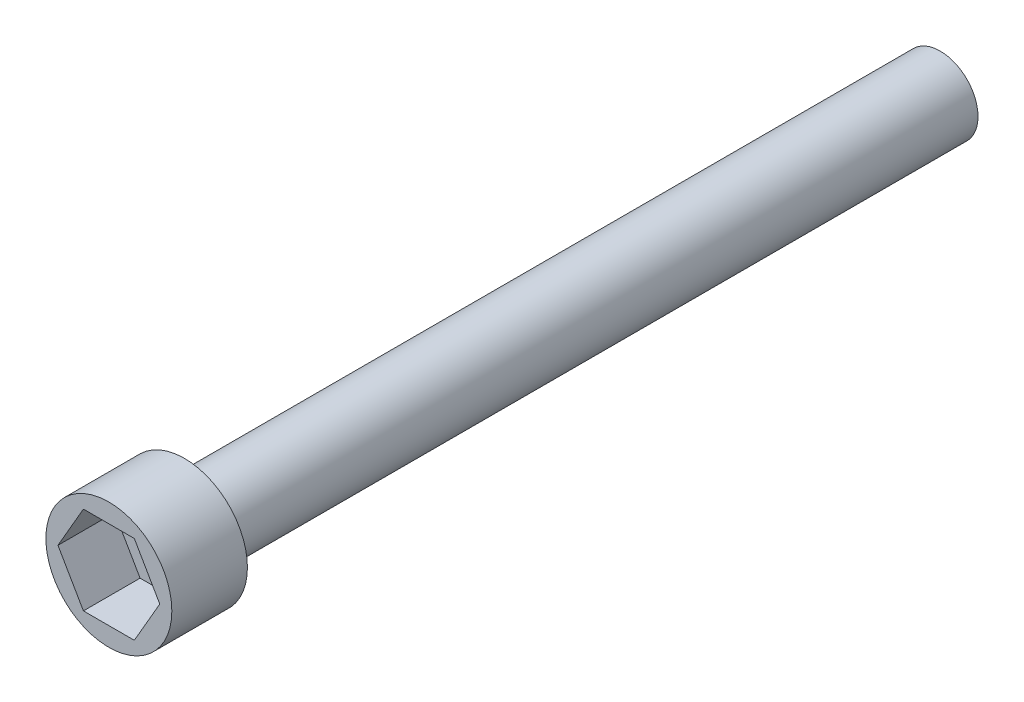
ISO-10303-21;
HEADER;
FILE_DESCRIPTION(('STEP AP214'),'2;1');
FILE_NAME('part.step','',(''),(''),'','','');
FILE_SCHEMA(('AUTOMOTIVE_DESIGN { 1 0 10303 214 1 1 1 1 }'));
ENDSEC;
DATA;
#1=APPLICATION_CONTEXT('core data for automotive mechanical design processes');
#2=APPLICATION_PROTOCOL_DEFINITION('international standard','automotive_design',2000,#1);
#3=PRODUCT_CONTEXT('',#1,'mechanical');
#4=PRODUCT('Part','Part','',(#3));
#5=PRODUCT_RELATED_PRODUCT_CATEGORY('part','',(#4));
#6=PRODUCT_DEFINITION_FORMATION('','',#4);
#7=PRODUCT_DEFINITION_CONTEXT('part definition',#1,'design');
#8=PRODUCT_DEFINITION('design','',#6,#7);
#9=PRODUCT_DEFINITION_SHAPE('','',#8);
#10=(LENGTH_UNIT() NAMED_UNIT(*) SI_UNIT(.MILLI.,.METRE.));
#11=(NAMED_UNIT(*) PLANE_ANGLE_UNIT() SI_UNIT($,.RADIAN.));
#12=(NAMED_UNIT(*) SI_UNIT($,.STERADIAN.) SOLID_ANGLE_UNIT());
#13=UNCERTAINTY_MEASURE_WITH_UNIT(LENGTH_MEASURE(1.E-05),#10,'distance_accuracy_value','');
#14=(GEOMETRIC_REPRESENTATION_CONTEXT(3) GLOBAL_UNCERTAINTY_ASSIGNED_CONTEXT((#13)) GLOBAL_UNIT_ASSIGNED_CONTEXT((#10,
#11,#12)) REPRESENTATION_CONTEXT('',''));
#15=CARTESIAN_POINT('',(0.,0.,0.));
#16=DIRECTION('',(0.,0.,1.));
#17=DIRECTION('',(1.,0.,0.));
#18=AXIS2_PLACEMENT_3D('',#15,#16,#17);
#19=CARTESIAN_POINT('',(0.,0.,60.));
#20=DIRECTION('',(0.,0.,-1.));
#21=DIRECTION('',(-1.,0.,0.));
#22=AXIS2_PLACEMENT_3D('',#19,#20,#21);
#23=CYLINDRICAL_SURFACE('',#22,3.);
#24=CARTESIAN_POINT('',(0.,0.,60.));
#25=DIRECTION('',(0.,0.,1.));
#26=DIRECTION('',(1.,0.,0.));
#27=AXIS2_PLACEMENT_3D('',#24,#25,#26);
#28=CIRCLE('',#27,3.);
#29=CARTESIAN_POINT('',(3.,0.,60.));
#30=VERTEX_POINT('',#29);
#31=EDGE_CURVE('E11',#30,#30,#28,.T.);
#32=ORIENTED_EDGE('',*,*,#31,.F.);
#33=EDGE_LOOP('',(#32));
#34=FACE_BOUND('',#33,.T.);
#35=CARTESIAN_POINT('',(0.,0.,0.));
#36=DIRECTION('',(0.,0.,1.));
#37=DIRECTION('',(1.,0.,0.));
#38=AXIS2_PLACEMENT_3D('',#35,#36,#37);
#39=CIRCLE('',#38,3.);
#40=CARTESIAN_POINT('',(3.,0.,0.));
#41=VERTEX_POINT('',#40);
#42=EDGE_CURVE('E44',#41,#41,#39,.T.);
#43=ORIENTED_EDGE('',*,*,#42,.T.);
#44=EDGE_LOOP('',(#43));
#45=FACE_BOUND('',#44,.T.);
#46=ADVANCED_FACE('F41',(#34,#45),#23,.T.);
#47=CARTESIAN_POINT('',(0.,0.,0.));
#48=DIRECTION('',(0.,0.,1.));
#49=DIRECTION('',(1.,0.,0.));
#50=AXIS2_PLACEMENT_3D('',#47,#48,#49);
#51=PLANE('',#50);
#52=ORIENTED_EDGE('',*,*,#42,.F.);
#53=EDGE_LOOP('',(#52));
#54=FACE_BOUND('',#53,.T.);
#55=ADVANCED_FACE('F191',(#54),#51,.F.);
#56=CARTESIAN_POINT('',(0.,0.,66.));
#57=DIRECTION('',(0.,0.,-1.));
#58=DIRECTION('',(-1.,0.,0.));
#59=AXIS2_PLACEMENT_3D('',#56,#57,#58);
#60=CYLINDRICAL_SURFACE('',#59,5.);
#61=CARTESIAN_POINT('',(0.,0.,66.));
#62=DIRECTION('',(0.,0.,1.));
#63=DIRECTION('',(1.,0.,0.));
#64=AXIS2_PLACEMENT_3D('',#61,#62,#63);
#65=CIRCLE('',#64,5.);
#66=CARTESIAN_POINT('',(5.,0.,66.));
#67=VERTEX_POINT('',#66);
#68=EDGE_CURVE('E165',#67,#67,#65,.T.);
#69=ORIENTED_EDGE('',*,*,#68,.F.);
#70=EDGE_LOOP('',(#69));
#71=FACE_BOUND('',#70,.T.);
#72=CARTESIAN_POINT('',(0.,0.,60.));
#73=DIRECTION('',(0.,0.,1.));
#74=DIRECTION('',(1.,0.,0.));
#75=AXIS2_PLACEMENT_3D('',#72,#73,#74);
#76=CIRCLE('',#75,5.);
#77=CARTESIAN_POINT('',(5.,0.,60.));
#78=VERTEX_POINT('',#77);
#79=EDGE_CURVE('E155',#78,#78,#76,.T.);
#80=ORIENTED_EDGE('',*,*,#79,.T.);
#81=EDGE_LOOP('',(#80));
#82=FACE_BOUND('',#81,.T.);
#83=ADVANCED_FACE('F173',(#71,#82),#60,.T.);
#84=CARTESIAN_POINT('',(0.,0.,66.));
#85=DIRECTION('',(0.,0.,1.));
#86=DIRECTION('',(1.,0.,0.));
#87=AXIS2_PLACEMENT_3D('',#84,#85,#86);
#88=PLANE('',#87);
#89=DIRECTION('',(0.5,0.866025403784439,0.));
#90=VECTOR('',#89,1.);
#91=CARTESIAN_POINT('',(2.02072594216369,-3.5,66.));
#92=LINE('',#91,#90);
#93=CARTESIAN_POINT('',(2.02072594216369,-3.5,66.));
#94=VERTEX_POINT('',#93);
#95=CARTESIAN_POINT('',(4.04145188432738,0.,66.));
#96=VERTEX_POINT('',#95);
#97=EDGE_CURVE('E56',#94,#96,#92,.T.);
#98=ORIENTED_EDGE('',*,*,#97,.F.);
#99=DIRECTION('',(1.,0.,0.));
#100=VECTOR('',#99,1.);
#101=CARTESIAN_POINT('',(-2.02072594216369,-3.5,66.));
#102=LINE('',#101,#100);
#103=CARTESIAN_POINT('',(-2.02072594216369,-3.5,66.));
#104=VERTEX_POINT('',#103);
#105=EDGE_CURVE('E149',#104,#94,#102,.T.);
#106=ORIENTED_EDGE('',*,*,#105,.F.);
#107=DIRECTION('',(0.5,-0.866025403784439,0.));
#108=VECTOR('',#107,1.);
#109=CARTESIAN_POINT('',(-4.04145188432738,0.,66.));
#110=LINE('',#109,#108);
#111=CARTESIAN_POINT('',(-4.04145188432738,0.,66.));
#112=VERTEX_POINT('',#111);
#113=EDGE_CURVE('E146',#112,#104,#110,.T.);
#114=ORIENTED_EDGE('',*,*,#113,.F.);
#115=DIRECTION('',(-0.5,-0.866025403784439,0.));
#116=VECTOR('',#115,1.);
#117=CARTESIAN_POINT('',(-2.02072594216369,3.5,66.));
#118=LINE('',#117,#116);
#119=CARTESIAN_POINT('',(-2.02072594216369,3.5,66.));
#120=VERTEX_POINT('',#119);
#121=EDGE_CURVE('E104',#120,#112,#118,.T.);
#122=ORIENTED_EDGE('',*,*,#121,.F.);
#123=DIRECTION('',(-1.,0.,0.));
#124=VECTOR('',#123,1.);
#125=CARTESIAN_POINT('',(2.02072594216369,3.5,66.));
#126=LINE('',#125,#124);
#127=CARTESIAN_POINT('',(2.02072594216369,3.5,66.));
#128=VERTEX_POINT('',#127);
#129=EDGE_CURVE('E140',#128,#120,#126,.T.);
#130=ORIENTED_EDGE('',*,*,#129,.F.);
#131=DIRECTION('',(-0.5,0.866025403784439,0.));
#132=VECTOR('',#131,1.);
#133=CARTESIAN_POINT('',(4.04145188432738,0.,66.));
#134=LINE('',#133,#132);
#135=EDGE_CURVE('E136',#96,#128,#134,.T.);
#136=ORIENTED_EDGE('',*,*,#135,.F.);
#137=EDGE_LOOP('',(#98,#106,#114,#122,#130,#136));
#138=FACE_BOUND('',#137,.T.);
#139=ORIENTED_EDGE('',*,*,#68,.T.);
#140=EDGE_LOOP('',(#139));
#141=FACE_BOUND('',#140,.T.);
#142=ADVANCED_FACE('F178',(#138,#141),#88,.T.);
#143=CARTESIAN_POINT('',(0.,0.,60.));
#144=DIRECTION('',(0.,0.,1.));
#145=DIRECTION('',(1.,0.,0.));
#146=AXIS2_PLACEMENT_3D('',#143,#144,#145);
#147=PLANE('',#146);
#148=ORIENTED_EDGE('',*,*,#31,.T.);
#149=EDGE_LOOP('',(#148));
#150=FACE_BOUND('',#149,.T.);
#151=ORIENTED_EDGE('',*,*,#79,.F.);
#152=EDGE_LOOP('',(#151));
#153=FACE_BOUND('',#152,.T.);
#154=ADVANCED_FACE('F175',(#150,#153),#147,.F.);
#155=CARTESIAN_POINT('',(2.02072594216369,-3.5,61.5));
#156=DIRECTION('',(0.866025403784439,-0.5,0.));
#157=DIRECTION('',(0.5,0.866025403784439,0.));
#158=AXIS2_PLACEMENT_3D('',#155,#156,#157);
#159=PLANE('',#158);
#160=ORIENTED_EDGE('',*,*,#97,.T.);
#161=DIRECTION('',(0.,0.,1.));
#162=VECTOR('',#161,1.);
#163=CARTESIAN_POINT('',(4.04145188432738,0.,61.5));
#164=LINE('',#163,#162);
#165=CARTESIAN_POINT('',(4.04145188432738,0.,61.5));
#166=VERTEX_POINT('',#165);
#167=EDGE_CURVE('E86',#166,#96,#164,.T.);
#168=ORIENTED_EDGE('',*,*,#167,.F.);
#169=DIRECTION('',(0.5,0.866025403784439,0.));
#170=VECTOR('',#169,1.);
#171=CARTESIAN_POINT('',(2.02072594216369,-3.5,61.5));
#172=LINE('',#171,#170);
#173=CARTESIAN_POINT('',(2.02072594216369,-3.5,61.5));
#174=VERTEX_POINT('',#173);
#175=EDGE_CURVE('E152',#174,#166,#172,.T.);
#176=ORIENTED_EDGE('',*,*,#175,.F.);
#177=DIRECTION('',(0.,0.,1.));
#178=VECTOR('',#177,1.);
#179=CARTESIAN_POINT('',(2.02072594216369,-3.5,61.5));
#180=LINE('',#179,#178);
#181=EDGE_CURVE('E64',#174,#94,#180,.T.);
#182=ORIENTED_EDGE('',*,*,#181,.T.);
#183=EDGE_LOOP('',(#160,#168,#176,#182));
#184=FACE_BOUND('',#183,.T.);
#185=ADVANCED_FACE('F177',(#184),#159,.F.);
#186=CARTESIAN_POINT('',(-2.02072594216369,-3.5,61.5));
#187=DIRECTION('',(0.,-1.,0.));
#188=DIRECTION('',(1.,0.,0.));
#189=AXIS2_PLACEMENT_3D('',#186,#187,#188);
#190=PLANE('',#189);
#191=ORIENTED_EDGE('',*,*,#105,.T.);
#192=ORIENTED_EDGE('',*,*,#181,.F.);
#193=DIRECTION('',(1.,0.,0.));
#194=VECTOR('',#193,1.);
#195=CARTESIAN_POINT('',(-2.02072594216369,-3.5,61.5));
#196=LINE('',#195,#194);
#197=CARTESIAN_POINT('',(-2.02072594216369,-3.5,61.5));
#198=VERTEX_POINT('',#197);
#199=EDGE_CURVE('E118',#198,#174,#196,.T.);
#200=ORIENTED_EDGE('',*,*,#199,.F.);
#201=DIRECTION('',(0.,0.,1.));
#202=VECTOR('',#201,1.);
#203=CARTESIAN_POINT('',(-2.02072594216369,-3.5,61.5));
#204=LINE('',#203,#202);
#205=EDGE_CURVE('E109',#198,#104,#204,.T.);
#206=ORIENTED_EDGE('',*,*,#205,.T.);
#207=EDGE_LOOP('',(#191,#192,#200,#206));
#208=FACE_BOUND('',#207,.T.);
#209=ADVANCED_FACE('F185',(#208),#190,.F.);
#210=CARTESIAN_POINT('',(-4.04145188432738,0.,61.5));
#211=DIRECTION('',(-0.866025403784439,-0.5,0.));
#212=DIRECTION('',(0.5,-0.866025403784439,0.));
#213=AXIS2_PLACEMENT_3D('',#210,#211,#212);
#214=PLANE('',#213);
#215=ORIENTED_EDGE('',*,*,#113,.T.);
#216=ORIENTED_EDGE('',*,*,#205,.F.);
#217=DIRECTION('',(0.5,-0.866025403784439,0.));
#218=VECTOR('',#217,1.);
#219=CARTESIAN_POINT('',(-4.04145188432738,0.,61.5));
#220=LINE('',#219,#218);
#221=CARTESIAN_POINT('',(-4.04145188432738,0.,61.5));
#222=VERTEX_POINT('',#221);
#223=EDGE_CURVE('E113',#222,#198,#220,.T.);
#224=ORIENTED_EDGE('',*,*,#223,.F.);
#225=DIRECTION('',(0.,0.,1.));
#226=VECTOR('',#225,1.);
#227=CARTESIAN_POINT('',(-4.04145188432738,0.,61.5));
#228=LINE('',#227,#226);
#229=EDGE_CURVE('E97',#222,#112,#228,.T.);
#230=ORIENTED_EDGE('',*,*,#229,.T.);
#231=EDGE_LOOP('',(#215,#216,#224,#230));
#232=FACE_BOUND('',#231,.T.);
#233=ADVANCED_FACE('F114',(#232),#214,.F.);
#234=CARTESIAN_POINT('',(-2.02072594216369,3.5,61.5));
#235=DIRECTION('',(-0.866025403784439,0.5,0.));
#236=DIRECTION('',(-0.5,-0.866025403784439,0.));
#237=AXIS2_PLACEMENT_3D('',#234,#235,#236);
#238=PLANE('',#237);
#239=ORIENTED_EDGE('',*,*,#121,.T.);
#240=ORIENTED_EDGE('',*,*,#229,.F.);
#241=DIRECTION('',(-0.5,-0.866025403784439,0.));
#242=VECTOR('',#241,1.);
#243=CARTESIAN_POINT('',(-2.02072594216369,3.5,61.5));
#244=LINE('',#243,#242);
#245=CARTESIAN_POINT('',(-2.02072594216369,3.5,61.5));
#246=VERTEX_POINT('',#245);
#247=EDGE_CURVE('E101',#246,#222,#244,.T.);
#248=ORIENTED_EDGE('',*,*,#247,.F.);
#249=DIRECTION('',(0.,0.,1.));
#250=VECTOR('',#249,1.);
#251=CARTESIAN_POINT('',(-2.02072594216369,3.5,61.5));
#252=LINE('',#251,#250);
#253=EDGE_CURVE('E110',#246,#120,#252,.T.);
#254=ORIENTED_EDGE('',*,*,#253,.T.);
#255=EDGE_LOOP('',(#239,#240,#248,#254));
#256=FACE_BOUND('',#255,.T.);
#257=ADVANCED_FACE('F99',(#256),#238,.F.);
#258=CARTESIAN_POINT('',(2.02072594216369,3.5,61.5));
#259=DIRECTION('',(0.,1.,0.));
#260=DIRECTION('',(-1.,0.,0.));
#261=AXIS2_PLACEMENT_3D('',#258,#259,#260);
#262=PLANE('',#261);
#263=ORIENTED_EDGE('',*,*,#129,.T.);
#264=ORIENTED_EDGE('',*,*,#253,.F.);
#265=DIRECTION('',(-1.,0.,0.));
#266=VECTOR('',#265,1.);
#267=CARTESIAN_POINT('',(2.02072594216369,3.5,61.5));
#268=LINE('',#267,#266);
#269=CARTESIAN_POINT('',(2.02072594216369,3.5,61.5));
#270=VERTEX_POINT('',#269);
#271=EDGE_CURVE('E124',#270,#246,#268,.T.);
#272=ORIENTED_EDGE('',*,*,#271,.F.);
#273=DIRECTION('',(0.,0.,1.));
#274=VECTOR('',#273,1.);
#275=CARTESIAN_POINT('',(2.02072594216369,3.5,61.5));
#276=LINE('',#275,#274);
#277=EDGE_CURVE('E160',#270,#128,#276,.T.);
#278=ORIENTED_EDGE('',*,*,#277,.T.);
#279=EDGE_LOOP('',(#263,#264,#272,#278));
#280=FACE_BOUND('',#279,.T.);
#281=ADVANCED_FACE('F247',(#280),#262,.F.);
#282=CARTESIAN_POINT('',(4.04145188432738,0.,61.5));
#283=DIRECTION('',(0.866025403784439,0.5,0.));
#284=DIRECTION('',(-0.5,0.866025403784439,0.));
#285=AXIS2_PLACEMENT_3D('',#282,#283,#284);
#286=PLANE('',#285);
#287=ORIENTED_EDGE('',*,*,#135,.T.);
#288=ORIENTED_EDGE('',*,*,#277,.F.);
#289=DIRECTION('',(-0.5,0.866025403784439,0.));
#290=VECTOR('',#289,1.);
#291=CARTESIAN_POINT('',(4.04145188432738,0.,61.5));
#292=LINE('',#291,#290);
#293=EDGE_CURVE('E128',#166,#270,#292,.T.);
#294=ORIENTED_EDGE('',*,*,#293,.F.);
#295=ORIENTED_EDGE('',*,*,#167,.T.);
#296=EDGE_LOOP('',(#287,#288,#294,#295));
#297=FACE_BOUND('',#296,.T.);
#298=ADVANCED_FACE('F256',(#297),#286,.F.);
#299=CARTESIAN_POINT('',(0.,0.,61.5));
#300=DIRECTION('',(0.,0.,1.));
#301=DIRECTION('',(1.,0.,0.));
#302=AXIS2_PLACEMENT_3D('',#299,#300,#301);
#303=PLANE('',#302);
#304=ORIENTED_EDGE('',*,*,#175,.T.);
#305=ORIENTED_EDGE('',*,*,#293,.T.);
#306=ORIENTED_EDGE('',*,*,#271,.T.);
#307=ORIENTED_EDGE('',*,*,#247,.T.);
#308=ORIENTED_EDGE('',*,*,#223,.T.);
#309=ORIENTED_EDGE('',*,*,#199,.T.);
#310=EDGE_LOOP('',(#304,#305,#306,#307,#308,#309));
#311=FACE_BOUND('',#310,.T.);
#312=ADVANCED_FACE('F121',(#311),#303,.T.);
#313=CLOSED_SHELL('',(#46,#55,#83,#142,#154,#185,#209,#233,#257,#281,#298,#312));
#314=MANIFOLD_SOLID_BREP('B2',#313);
#315=ADVANCED_BREP_SHAPE_REPRESENTATION('',(#18,#314),#14);
#316=SHAPE_DEFINITION_REPRESENTATION(#9,#315);
ENDSEC;
END-ISO-10303-21;
